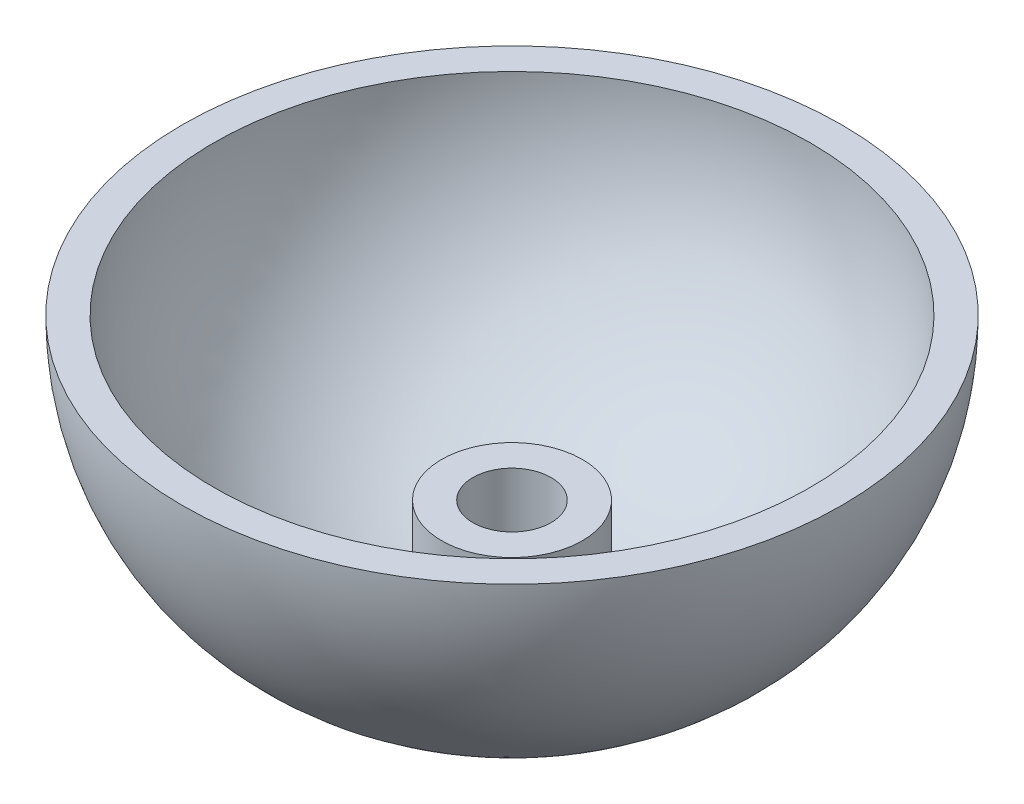
ISO-10303-21;
HEADER;
FILE_DESCRIPTION(('STEP AP214'),'2;1');
FILE_NAME('part.step','',(''),(''),'','','');
FILE_SCHEMA(('AUTOMOTIVE_DESIGN { 1 0 10303 214 1 1 1 1 }'));
ENDSEC;
DATA;
#1=APPLICATION_CONTEXT('core data for automotive mechanical design processes');
#2=APPLICATION_PROTOCOL_DEFINITION('international standard','automotive_design',2000,#1);
#3=PRODUCT_CONTEXT('',#1,'mechanical');
#4=PRODUCT('Part','Part','',(#3));
#5=PRODUCT_RELATED_PRODUCT_CATEGORY('part','',(#4));
#6=PRODUCT_DEFINITION_FORMATION('','',#4);
#7=PRODUCT_DEFINITION_CONTEXT('part definition',#1,'design');
#8=PRODUCT_DEFINITION('design','',#6,#7);
#9=PRODUCT_DEFINITION_SHAPE('','',#8);
#10=(LENGTH_UNIT() NAMED_UNIT(*) SI_UNIT(.MILLI.,.METRE.));
#11=(NAMED_UNIT(*) PLANE_ANGLE_UNIT() SI_UNIT($,.RADIAN.));
#12=(NAMED_UNIT(*) SI_UNIT($,.STERADIAN.) SOLID_ANGLE_UNIT());
#13=UNCERTAINTY_MEASURE_WITH_UNIT(LENGTH_MEASURE(1.E-05),#10,'distance_accuracy_value','');
#14=(GEOMETRIC_REPRESENTATION_CONTEXT(3) GLOBAL_UNCERTAINTY_ASSIGNED_CONTEXT((#13)) GLOBAL_UNIT_ASSIGNED_CONTEXT((#10,
#11,#12)) REPRESENTATION_CONTEXT('',''));
#15=CARTESIAN_POINT('',(0.,0.,0.));
#16=DIRECTION('',(0.,0.,1.));
#17=DIRECTION('',(1.,0.,0.));
#18=AXIS2_PLACEMENT_3D('',#15,#16,#17);
#19=CARTESIAN_POINT('',(0.,0.,0.));
#20=DIRECTION('',(0.,-1.,0.));
#21=DIRECTION('',(0.,0.,-1.));
#22=AXIS2_PLACEMENT_3D('',#19,#20,#21);
#23=CYLINDRICAL_SURFACE('',#22,1.5);
#24=CARTESIAN_POINT('',(0.,5.,0.));
#25=DIRECTION('',(0.,-1.,0.));
#26=DIRECTION('',(0.,0.,-1.));
#27=AXIS2_PLACEMENT_3D('',#24,#25,#26);
#28=CIRCLE('',#27,1.5);
#29=CARTESIAN_POINT('',(0.,5.,-1.5));
#30=VERTEX_POINT('',#29);
#31=EDGE_CURVE('E10',#30,#30,#28,.T.);
#32=ORIENTED_EDGE('',*,*,#31,.F.);
#33=EDGE_LOOP('',(#32));
#34=FACE_BOUND('',#33,.T.);
#35=CARTESIAN_POINT('',(0.,0.,0.));
#36=DIRECTION('',(0.,-1.,0.));
#37=DIRECTION('',(0.,0.,-1.));
#38=AXIS2_PLACEMENT_3D('',#35,#36,#37);
#39=CIRCLE('',#38,1.5);
#40=CARTESIAN_POINT('',(0.,0.,-1.5));
#41=VERTEX_POINT('',#40);
#42=EDGE_CURVE('E54',#41,#41,#39,.T.);
#43=ORIENTED_EDGE('',*,*,#42,.T.);
#44=EDGE_LOOP('',(#43));
#45=FACE_BOUND('',#44,.T.);
#46=ADVANCED_FACE('F32',(#34,#45),#23,.F.);
#47=CARTESIAN_POINT('',(-2.7,5.,0.));
#48=DIRECTION('',(0.,1.,0.));
#49=DIRECTION('',(0.,0.,1.));
#50=AXIS2_PLACEMENT_3D('',#47,#48,#49);
#51=PLANE('',#50);
#52=ORIENTED_EDGE('',*,*,#31,.T.);
#53=EDGE_LOOP('',(#52));
#54=FACE_BOUND('',#53,.T.);
#55=CARTESIAN_POINT('',(0.,5.,0.));
#56=DIRECTION('',(0.,-1.,0.));
#57=DIRECTION('',(0.,0.,-1.));
#58=AXIS2_PLACEMENT_3D('',#55,#56,#57);
#59=CIRCLE('',#58,2.7);
#60=CARTESIAN_POINT('',(0.,5.,-2.7));
#61=VERTEX_POINT('',#60);
#62=EDGE_CURVE('E38',#61,#61,#59,.T.);
#63=ORIENTED_EDGE('',*,*,#62,.F.);
#64=EDGE_LOOP('',(#63));
#65=FACE_BOUND('',#64,.T.);
#66=ADVANCED_FACE('F77',(#54,#65),#51,.T.);
#67=CARTESIAN_POINT('',(0.,0.,0.));
#68=DIRECTION('',(0.,-1.,0.));
#69=DIRECTION('',(0.,0.,-1.));
#70=AXIS2_PLACEMENT_3D('',#67,#68,#69);
#71=CYLINDRICAL_SURFACE('',#70,2.7);
#72=ORIENTED_EDGE('',*,*,#62,.T.);
#73=EDGE_LOOP('',(#72));
#74=FACE_BOUND('',#73,.T.);
#75=CARTESIAN_POINT('',(0.,1.27268584560037,0.));
#76=DIRECTION('',(0.,-1.,0.));
#77=DIRECTION('',(0.,0.,-1.));
#78=AXIS2_PLACEMENT_3D('',#75,#76,#77);
#79=CIRCLE('',#78,2.7);
#80=CARTESIAN_POINT('',(0.,1.27268584560037,-2.7));
#81=VERTEX_POINT('',#80);
#82=EDGE_CURVE('E42',#81,#81,#79,.T.);
#83=ORIENTED_EDGE('',*,*,#82,.F.);
#84=EDGE_LOOP('',(#83));
#85=FACE_BOUND('',#84,.T.);
#86=ADVANCED_FACE('F73',(#74,#85),#71,.T.);
#87=CARTESIAN_POINT('',(0.,11.141985404537,0.));
#88=DIRECTION('',(0.,-1.,0.));
#89=DIRECTION('',(0.,0.,-1.));
#90=AXIS2_PLACEMENT_3D('',#87,#88,#89);
#91=DEGENERATE_TOROIDAL_SURFACE('',#90,1.5,9.94198540453699,.T.);
#92=ORIENTED_EDGE('',*,*,#82,.T.);
#93=EDGE_LOOP('',(#92));
#94=FACE_BOUND('',#93,.T.);
#95=CARTESIAN_POINT('',(0.,11.141985404537,0.));
#96=DIRECTION('',(0.,-1.,0.));
#97=DIRECTION('',(0.,0.,-1.));
#98=AXIS2_PLACEMENT_3D('',#95,#96,#97);
#99=CIRCLE('',#98,11.441985404537);
#100=CARTESIAN_POINT('',(0.,11.141985404537,-11.441985404537));
#101=VERTEX_POINT('',#100);
#102=EDGE_CURVE('E46',#101,#101,#99,.T.);
#103=ORIENTED_EDGE('',*,*,#102,.F.);
#104=EDGE_LOOP('',(#103));
#105=FACE_BOUND('',#104,.T.);
#106=ADVANCED_FACE('F67',(#94,#105),#91,.F.);
#107=CARTESIAN_POINT('',(-12.641985404537,11.141985404537,0.));
#108=DIRECTION('',(0.,1.,0.));
#109=DIRECTION('',(0.,0.,1.));
#110=AXIS2_PLACEMENT_3D('',#107,#108,#109);
#111=PLANE('',#110);
#112=ORIENTED_EDGE('',*,*,#102,.T.);
#113=EDGE_LOOP('',(#112));
#114=FACE_BOUND('',#113,.T.);
#115=CARTESIAN_POINT('',(0.,11.141985404537,0.));
#116=DIRECTION('',(0.,-1.,0.));
#117=DIRECTION('',(0.,0.,-1.));
#118=AXIS2_PLACEMENT_3D('',#115,#116,#117);
#119=CIRCLE('',#118,12.641985404537);
#120=CARTESIAN_POINT('',(0.,11.141985404537,-12.641985404537));
#121=VERTEX_POINT('',#120);
#122=EDGE_CURVE('E51',#121,#121,#119,.T.);
#123=ORIENTED_EDGE('',*,*,#122,.F.);
#124=EDGE_LOOP('',(#123));
#125=FACE_BOUND('',#124,.T.);
#126=ADVANCED_FACE('F62',(#114,#125),#111,.T.);
#127=CARTESIAN_POINT('',(0.,11.141985404537,0.));
#128=DIRECTION('',(0.,-1.,0.));
#129=DIRECTION('',(0.,0.,-1.));
#130=AXIS2_PLACEMENT_3D('',#127,#128,#129);
#131=DEGENERATE_TOROIDAL_SURFACE('',#130,1.5,11.141985404537,.T.);
#132=ORIENTED_EDGE('',*,*,#42,.F.);
#133=EDGE_LOOP('',(#132));
#134=FACE_BOUND('',#133,.T.);
#135=ORIENTED_EDGE('',*,*,#122,.T.);
#136=EDGE_LOOP('',(#135));
#137=FACE_BOUND('',#136,.T.);
#138=ADVANCED_FACE('F59',(#134,#137),#131,.T.);
#139=CLOSED_SHELL('',(#46,#66,#86,#106,#126,#138));
#140=MANIFOLD_SOLID_BREP('B2',#139);
#141=ADVANCED_BREP_SHAPE_REPRESENTATION('',(#18,#140),#14);
#142=SHAPE_DEFINITION_REPRESENTATION(#9,#141);
ENDSEC;
END-ISO-10303-21;
